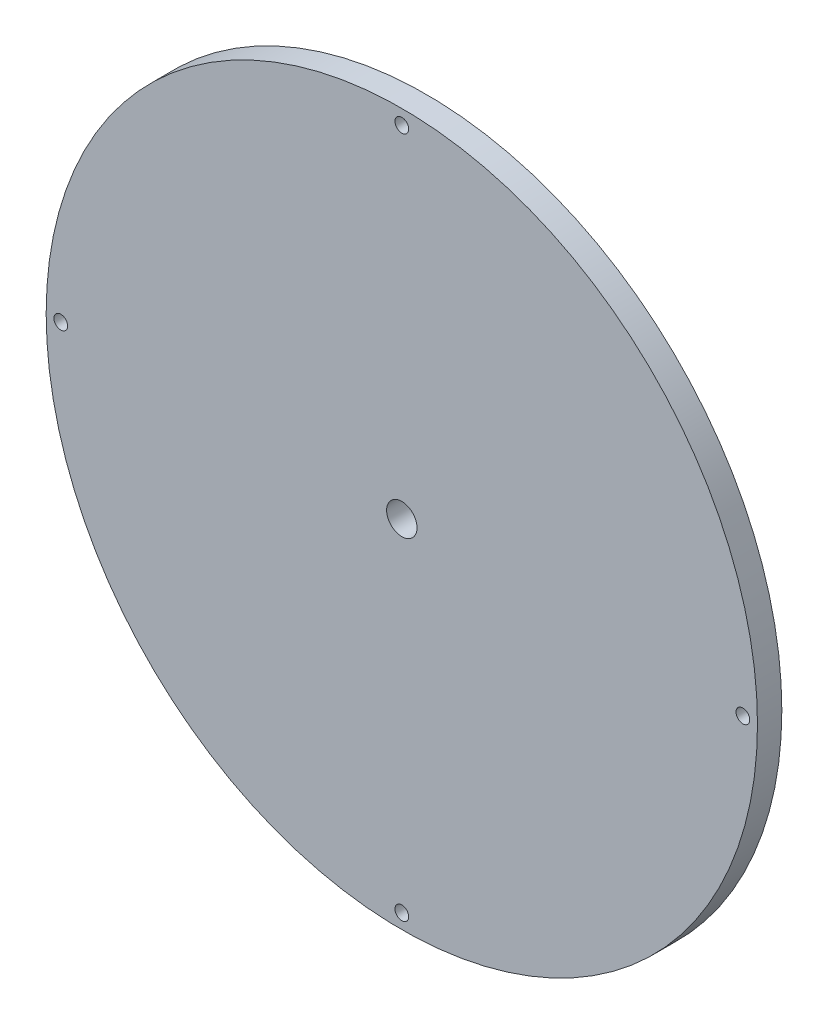
ISO-10303-21;
HEADER;
FILE_DESCRIPTION(('STEP AP214'),'2;1');
FILE_NAME('part.step','',(''),(''),'','','');
FILE_SCHEMA(('AUTOMOTIVE_DESIGN { 1 0 10303 214 1 1 1 1 }'));
ENDSEC;
DATA;
#1=APPLICATION_CONTEXT('core data for automotive mechanical design processes');
#2=APPLICATION_PROTOCOL_DEFINITION('international standard','automotive_design',2000,#1);
#3=PRODUCT_CONTEXT('',#1,'mechanical');
#4=PRODUCT('Part','Part','',(#3));
#5=PRODUCT_RELATED_PRODUCT_CATEGORY('part','',(#4));
#6=PRODUCT_DEFINITION_FORMATION('','',#4);
#7=PRODUCT_DEFINITION_CONTEXT('part definition',#1,'design');
#8=PRODUCT_DEFINITION('design','',#6,#7);
#9=PRODUCT_DEFINITION_SHAPE('','',#8);
#10=(LENGTH_UNIT() NAMED_UNIT(*) SI_UNIT(.MILLI.,.METRE.));
#11=(NAMED_UNIT(*) PLANE_ANGLE_UNIT() SI_UNIT($,.RADIAN.));
#12=(NAMED_UNIT(*) SI_UNIT($,.STERADIAN.) SOLID_ANGLE_UNIT());
#13=UNCERTAINTY_MEASURE_WITH_UNIT(LENGTH_MEASURE(1.E-05),#10,'distance_accuracy_value','');
#14=(GEOMETRIC_REPRESENTATION_CONTEXT(3) GLOBAL_UNCERTAINTY_ASSIGNED_CONTEXT((#13)) GLOBAL_UNIT_ASSIGNED_CONTEXT((#10,
#11,#12)) REPRESENTATION_CONTEXT('',''));
#15=CARTESIAN_POINT('',(0.,0.,0.));
#16=DIRECTION('',(0.,0.,1.));
#17=DIRECTION('',(1.,0.,0.));
#18=AXIS2_PLACEMENT_3D('',#15,#16,#17);
#19=CARTESIAN_POINT('',(0.,0.,6.35));
#20=DIRECTION('',(0.,0.,-1.));
#21=DIRECTION('',(-1.,0.,0.));
#22=AXIS2_PLACEMENT_3D('',#19,#20,#21);
#23=CYLINDRICAL_SURFACE('',#22,3.96875);
#24=CARTESIAN_POINT('',(0.,0.,6.35));
#25=DIRECTION('',(0.,0.,1.));
#26=DIRECTION('',(1.,0.,0.));
#27=AXIS2_PLACEMENT_3D('',#24,#25,#26);
#28=CIRCLE('',#27,3.96875);
#29=CARTESIAN_POINT('',(3.96875,0.,6.35));
#30=VERTEX_POINT('',#29);
#31=EDGE_CURVE('E43',#30,#30,#28,.T.);
#32=ORIENTED_EDGE('',*,*,#31,.T.);
#33=EDGE_LOOP('',(#32));
#34=FACE_BOUND('',#33,.T.);
#35=CARTESIAN_POINT('',(0.,0.,0.));
#36=DIRECTION('',(0.,0.,1.));
#37=DIRECTION('',(1.,0.,0.));
#38=AXIS2_PLACEMENT_3D('',#35,#36,#37);
#39=CIRCLE('',#38,3.96875);
#40=CARTESIAN_POINT('',(3.96875,0.,0.));
#41=VERTEX_POINT('',#40);
#42=EDGE_CURVE('E63',#41,#41,#39,.T.);
#43=ORIENTED_EDGE('',*,*,#42,.F.);
#44=EDGE_LOOP('',(#43));
#45=FACE_BOUND('',#44,.T.);
#46=ADVANCED_FACE('F35',(#34,#45),#23,.F.);
#47=CARTESIAN_POINT('',(0.,88.9,6.35));
#48=DIRECTION('',(0.,0.,-1.));
#49=DIRECTION('',(-1.,0.,0.));
#50=AXIS2_PLACEMENT_3D('',#47,#48,#49);
#51=CYLINDRICAL_SURFACE('',#50,1.78593750000001);
#52=CARTESIAN_POINT('',(0.,88.9,6.35));
#53=DIRECTION('',(0.,0.,1.));
#54=DIRECTION('',(1.,0.,0.));
#55=AXIS2_PLACEMENT_3D('',#52,#53,#54);
#56=CIRCLE('',#55,1.78593750000001);
#57=CARTESIAN_POINT('',(1.78593750000001,88.9,6.35));
#58=VERTEX_POINT('',#57);
#59=EDGE_CURVE('E48',#58,#58,#56,.T.);
#60=ORIENTED_EDGE('',*,*,#59,.T.);
#61=EDGE_LOOP('',(#60));
#62=FACE_BOUND('',#61,.T.);
#63=CARTESIAN_POINT('',(0.,88.9,0.));
#64=DIRECTION('',(0.,0.,1.));
#65=DIRECTION('',(1.,0.,0.));
#66=AXIS2_PLACEMENT_3D('',#63,#64,#65);
#67=CIRCLE('',#66,1.78593750000001);
#68=CARTESIAN_POINT('',(1.78593750000001,88.9,0.));
#69=VERTEX_POINT('',#68);
#70=EDGE_CURVE('E61',#69,#69,#67,.T.);
#71=ORIENTED_EDGE('',*,*,#70,.F.);
#72=EDGE_LOOP('',(#71));
#73=FACE_BOUND('',#72,.T.);
#74=ADVANCED_FACE('F84',(#62,#73),#51,.F.);
#75=CARTESIAN_POINT('',(88.9,2.48711469536218E-12,6.35));
#76=DIRECTION('',(0.,0.,-1.));
#77=DIRECTION('',(-1.,0.,0.));
#78=AXIS2_PLACEMENT_3D('',#75,#76,#77);
#79=CYLINDRICAL_SURFACE('',#78,1.78593750000269);
#80=CARTESIAN_POINT('',(88.9,2.48711469536218E-12,6.35));
#81=DIRECTION('',(0.,0.,1.));
#82=DIRECTION('',(1.,0.,0.));
#83=AXIS2_PLACEMENT_3D('',#80,#81,#82);
#84=CIRCLE('',#83,1.78593750000269);
#85=CARTESIAN_POINT('',(90.6859375000027,2.48711469536218E-12,6.35));
#86=VERTEX_POINT('',#85);
#87=EDGE_CURVE('E77',#86,#86,#84,.T.);
#88=ORIENTED_EDGE('',*,*,#87,.T.);
#89=EDGE_LOOP('',(#88));
#90=FACE_BOUND('',#89,.T.);
#91=CARTESIAN_POINT('',(88.9,2.48711469536218E-12,0.));
#92=DIRECTION('',(0.,0.,1.));
#93=DIRECTION('',(1.,0.,0.));
#94=AXIS2_PLACEMENT_3D('',#91,#92,#93);
#95=CIRCLE('',#94,1.78593750000269);
#96=CARTESIAN_POINT('',(90.6859375000027,2.48711469536218E-12,0.));
#97=VERTEX_POINT('',#96);
#98=EDGE_CURVE('E58',#97,#97,#95,.T.);
#99=ORIENTED_EDGE('',*,*,#98,.F.);
#100=EDGE_LOOP('',(#99));
#101=FACE_BOUND('',#100,.T.);
#102=ADVANCED_FACE('F102',(#90,#101),#79,.F.);
#103=CARTESIAN_POINT('',(2.52770719571838E-12,-88.8999999999975,6.35));
#104=DIRECTION('',(0.,0.,-1.));
#105=DIRECTION('',(-1.,0.,0.));
#106=AXIS2_PLACEMENT_3D('',#103,#104,#105);
#107=CYLINDRICAL_SURFACE('',#106,1.78593750000375);
#108=CARTESIAN_POINT('',(2.52770719571838E-12,-88.8999999999975,6.35));
#109=DIRECTION('',(0.,0.,1.));
#110=DIRECTION('',(1.,0.,0.));
#111=AXIS2_PLACEMENT_3D('',#108,#109,#110);
#112=CIRCLE('',#111,1.78593750000375);
#113=CARTESIAN_POINT('',(1.78593750000627,-88.8999999999975,6.35));
#114=VERTEX_POINT('',#113);
#115=EDGE_CURVE('E72',#114,#114,#112,.T.);
#116=ORIENTED_EDGE('',*,*,#115,.T.);
#117=EDGE_LOOP('',(#116));
#118=FACE_BOUND('',#117,.T.);
#119=CARTESIAN_POINT('',(2.52770719571838E-12,-88.8999999999975,0.));
#120=DIRECTION('',(0.,0.,1.));
#121=DIRECTION('',(1.,0.,0.));
#122=AXIS2_PLACEMENT_3D('',#119,#120,#121);
#123=CIRCLE('',#122,1.78593750000375);
#124=CARTESIAN_POINT('',(1.78593750000627,-88.8999999999975,0.));
#125=VERTEX_POINT('',#124);
#126=EDGE_CURVE('E55',#125,#125,#123,.T.);
#127=ORIENTED_EDGE('',*,*,#126,.F.);
#128=EDGE_LOOP('',(#127));
#129=FACE_BOUND('',#128,.T.);
#130=ADVANCED_FACE('F108',(#118,#129),#107,.F.);
#131=CARTESIAN_POINT('',(-88.8999999999975,0.,6.35));
#132=DIRECTION('',(0.,0.,-1.));
#133=DIRECTION('',(-1.,0.,0.));
#134=AXIS2_PLACEMENT_3D('',#131,#132,#133);
#135=CYLINDRICAL_SURFACE('',#134,1.78593750000163);
#136=CARTESIAN_POINT('',(-88.8999999999975,0.,6.35));
#137=DIRECTION('',(0.,0.,1.));
#138=DIRECTION('',(1.,0.,0.));
#139=AXIS2_PLACEMENT_3D('',#136,#137,#138);
#140=CIRCLE('',#139,1.78593750000163);
#141=CARTESIAN_POINT('',(-87.1140624999959,0.,6.35));
#142=VERTEX_POINT('',#141);
#143=EDGE_CURVE('E68',#142,#142,#140,.T.);
#144=ORIENTED_EDGE('',*,*,#143,.T.);
#145=EDGE_LOOP('',(#144));
#146=FACE_BOUND('',#145,.T.);
#147=CARTESIAN_POINT('',(-88.8999999999975,0.,0.));
#148=DIRECTION('',(0.,0.,1.));
#149=DIRECTION('',(1.,0.,0.));
#150=AXIS2_PLACEMENT_3D('',#147,#148,#149);
#151=CIRCLE('',#150,1.78593750000163);
#152=CARTESIAN_POINT('',(-87.1140624999959,0.,0.));
#153=VERTEX_POINT('',#152);
#154=EDGE_CURVE('E52',#153,#153,#151,.T.);
#155=ORIENTED_EDGE('',*,*,#154,.F.);
#156=EDGE_LOOP('',(#155));
#157=FACE_BOUND('',#156,.T.);
#158=ADVANCED_FACE('F37',(#146,#157),#135,.F.);
#159=CARTESIAN_POINT('',(0.,0.,6.35));
#160=DIRECTION('',(0.,0.,-1.));
#161=DIRECTION('',(-1.,0.,0.));
#162=AXIS2_PLACEMENT_3D('',#159,#160,#161);
#163=CYLINDRICAL_SURFACE('',#162,92.71);
#164=CARTESIAN_POINT('',(0.,0.,6.35));
#165=DIRECTION('',(0.,0.,1.));
#166=DIRECTION('',(1.,0.,0.));
#167=AXIS2_PLACEMENT_3D('',#164,#165,#166);
#168=CIRCLE('',#167,92.71);
#169=CARTESIAN_POINT('',(92.71,0.,6.35));
#170=VERTEX_POINT('',#169);
#171=EDGE_CURVE('E10',#170,#170,#168,.T.);
#172=ORIENTED_EDGE('',*,*,#171,.F.);
#173=EDGE_LOOP('',(#172));
#174=FACE_BOUND('',#173,.T.);
#175=CARTESIAN_POINT('',(0.,0.,0.));
#176=DIRECTION('',(0.,0.,1.));
#177=DIRECTION('',(1.,0.,0.));
#178=AXIS2_PLACEMENT_3D('',#175,#176,#177);
#179=CIRCLE('',#178,92.71);
#180=CARTESIAN_POINT('',(92.71,0.,0.));
#181=VERTEX_POINT('',#180);
#182=EDGE_CURVE('E39',#181,#181,#179,.T.);
#183=ORIENTED_EDGE('',*,*,#182,.T.);
#184=EDGE_LOOP('',(#183));
#185=FACE_BOUND('',#184,.T.);
#186=ADVANCED_FACE('F91',(#174,#185),#163,.T.);
#187=CARTESIAN_POINT('',(0.,0.,6.35));
#188=DIRECTION('',(0.,0.,1.));
#189=DIRECTION('',(1.,0.,0.));
#190=AXIS2_PLACEMENT_3D('',#187,#188,#189);
#191=PLANE('',#190);
#192=ORIENTED_EDGE('',*,*,#143,.F.);
#193=EDGE_LOOP('',(#192));
#194=FACE_BOUND('',#193,.T.);
#195=ORIENTED_EDGE('',*,*,#115,.F.);
#196=EDGE_LOOP('',(#195));
#197=FACE_BOUND('',#196,.T.);
#198=ORIENTED_EDGE('',*,*,#87,.F.);
#199=EDGE_LOOP('',(#198));
#200=FACE_BOUND('',#199,.T.);
#201=ORIENTED_EDGE('',*,*,#59,.F.);
#202=EDGE_LOOP('',(#201));
#203=FACE_BOUND('',#202,.T.);
#204=ORIENTED_EDGE('',*,*,#31,.F.);
#205=EDGE_LOOP('',(#204));
#206=FACE_BOUND('',#205,.T.);
#207=ORIENTED_EDGE('',*,*,#171,.T.);
#208=EDGE_LOOP('',(#207));
#209=FACE_BOUND('',#208,.T.);
#210=ADVANCED_FACE('F87',(#194,#197,#200,#203,#206,#209),#191,.T.);
#211=CARTESIAN_POINT('',(0.,0.,0.));
#212=DIRECTION('',(0.,0.,1.));
#213=DIRECTION('',(1.,0.,0.));
#214=AXIS2_PLACEMENT_3D('',#211,#212,#213);
#215=PLANE('',#214);
#216=ORIENTED_EDGE('',*,*,#154,.T.);
#217=EDGE_LOOP('',(#216));
#218=FACE_BOUND('',#217,.T.);
#219=ORIENTED_EDGE('',*,*,#126,.T.);
#220=EDGE_LOOP('',(#219));
#221=FACE_BOUND('',#220,.T.);
#222=ORIENTED_EDGE('',*,*,#98,.T.);
#223=EDGE_LOOP('',(#222));
#224=FACE_BOUND('',#223,.T.);
#225=ORIENTED_EDGE('',*,*,#70,.T.);
#226=EDGE_LOOP('',(#225));
#227=FACE_BOUND('',#226,.T.);
#228=ORIENTED_EDGE('',*,*,#42,.T.);
#229=EDGE_LOOP('',(#228));
#230=FACE_BOUND('',#229,.T.);
#231=ORIENTED_EDGE('',*,*,#182,.F.);
#232=EDGE_LOOP('',(#231));
#233=FACE_BOUND('',#232,.T.);
#234=ADVANCED_FACE('F90',(#218,#221,#224,#227,#230,#233),#215,.F.);
#235=CLOSED_SHELL('',(#46,#74,#102,#130,#158,#186,#210,#234));
#236=MANIFOLD_SOLID_BREP('B2',#235);
#237=ADVANCED_BREP_SHAPE_REPRESENTATION('',(#18,#236),#14);
#238=SHAPE_DEFINITION_REPRESENTATION(#9,#237);
ENDSEC;
END-ISO-10303-21;
